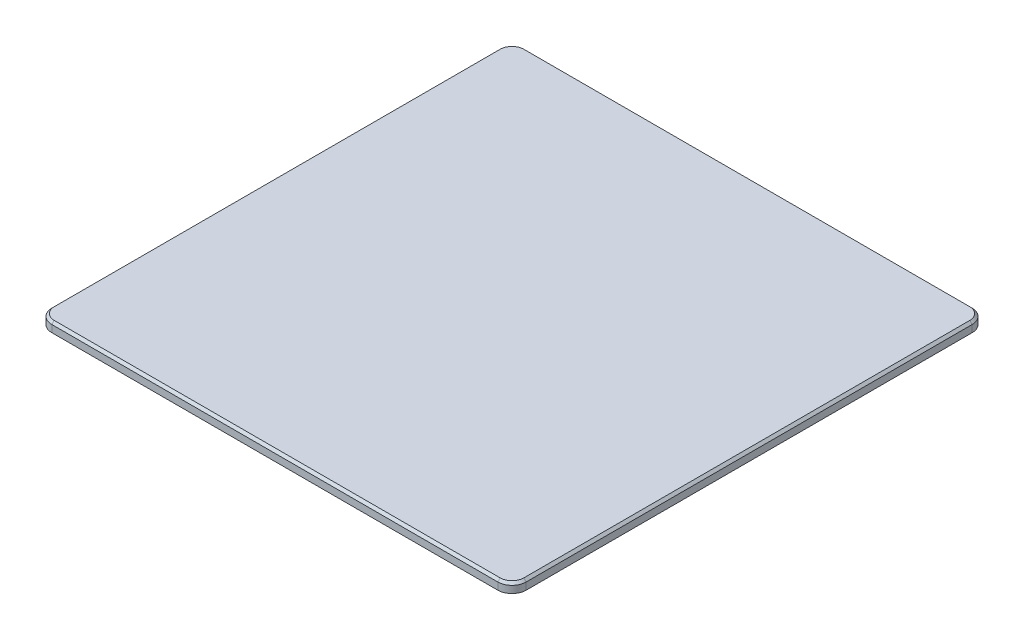
ISO-10303-21;
HEADER;
FILE_DESCRIPTION(('STEP AP214'),'2;1');
FILE_NAME('part.step','',(''),(''),'','','');
FILE_SCHEMA(('AUTOMOTIVE_DESIGN { 1 0 10303 214 1 1 1 1 }'));
ENDSEC;
DATA;
#1=APPLICATION_CONTEXT('core data for automotive mechanical design processes');
#2=APPLICATION_PROTOCOL_DEFINITION('international standard','automotive_design',2000,#1);
#3=PRODUCT_CONTEXT('',#1,'mechanical');
#4=PRODUCT('Part','Part','',(#3));
#5=PRODUCT_RELATED_PRODUCT_CATEGORY('part','',(#4));
#6=PRODUCT_DEFINITION_FORMATION('','',#4);
#7=PRODUCT_DEFINITION_CONTEXT('part definition',#1,'design');
#8=PRODUCT_DEFINITION('design','',#6,#7);
#9=PRODUCT_DEFINITION_SHAPE('','',#8);
#10=(LENGTH_UNIT() NAMED_UNIT(*) SI_UNIT(.MILLI.,.METRE.));
#11=(NAMED_UNIT(*) PLANE_ANGLE_UNIT() SI_UNIT($,.RADIAN.));
#12=(NAMED_UNIT(*) SI_UNIT($,.STERADIAN.) SOLID_ANGLE_UNIT());
#13=UNCERTAINTY_MEASURE_WITH_UNIT(LENGTH_MEASURE(1.E-05),#10,'distance_accuracy_value','');
#14=(GEOMETRIC_REPRESENTATION_CONTEXT(3) GLOBAL_UNCERTAINTY_ASSIGNED_CONTEXT((#13)) GLOBAL_UNIT_ASSIGNED_CONTEXT((#10,
#11,#12)) REPRESENTATION_CONTEXT('',''));
#15=CARTESIAN_POINT('',(0.,0.,0.));
#16=DIRECTION('',(0.,0.,1.));
#17=DIRECTION('',(1.,0.,0.));
#18=AXIS2_PLACEMENT_3D('',#15,#16,#17);
#19=CARTESIAN_POINT('',(47.,2.,-47.));
#20=DIRECTION('',(0.,-1.,0.));
#21=DIRECTION('',(0.,0.,-1.));
#22=AXIS2_PLACEMENT_3D('',#19,#20,#21);
#23=CYLINDRICAL_SURFACE('',#22,3.);
#24=DIRECTION('',(0.,-1.,0.));
#25=VECTOR('',#24,1.);
#26=CARTESIAN_POINT('',(47.,2.,-50.));
#27=LINE('',#26,#25);
#28=CARTESIAN_POINT('',(47.,1.49999999999997,-50.));
#29=VERTEX_POINT('',#28);
#30=CARTESIAN_POINT('',(47.,0.,-50.));
#31=VERTEX_POINT('',#30);
#32=EDGE_CURVE('E124',#29,#31,#27,.T.);
#33=ORIENTED_EDGE('',*,*,#32,.F.);
#34=CARTESIAN_POINT('',(47.,1.49999999999997,-47.));
#35=DIRECTION('',(0.,-1.,0.));
#36=DIRECTION('',(0.,0.,-1.));
#37=AXIS2_PLACEMENT_3D('',#34,#35,#36);
#38=CIRCLE('',#37,3.);
#39=CARTESIAN_POINT('',(50.,1.49999999999997,-47.));
#40=VERTEX_POINT('',#39);
#41=EDGE_CURVE('E11',#29,#40,#38,.T.);
#42=ORIENTED_EDGE('',*,*,#41,.T.);
#43=DIRECTION('',(0.,-1.,0.));
#44=VECTOR('',#43,1.);
#45=CARTESIAN_POINT('',(50.,2.,-47.));
#46=LINE('',#45,#44);
#47=CARTESIAN_POINT('',(50.,0.,-47.));
#48=VERTEX_POINT('',#47);
#49=EDGE_CURVE('E145',#40,#48,#46,.T.);
#50=ORIENTED_EDGE('',*,*,#49,.T.);
#51=CARTESIAN_POINT('',(47.,0.,-47.));
#52=DIRECTION('',(0.,1.,0.));
#53=DIRECTION('',(0.,0.,-1.));
#54=AXIS2_PLACEMENT_3D('',#51,#52,#53);
#55=CIRCLE('',#54,3.);
#56=EDGE_CURVE('E139',#48,#31,#55,.T.);
#57=ORIENTED_EDGE('',*,*,#56,.T.);
#58=EDGE_LOOP('',(#33,#42,#50,#57));
#59=FACE_BOUND('',#58,.T.);
#60=ADVANCED_FACE('F36',(#59),#23,.T.);
#61=CARTESIAN_POINT('',(-47.,2.,-50.));
#62=DIRECTION('',(0.,0.,1.));
#63=DIRECTION('',(1.,0.,0.));
#64=AXIS2_PLACEMENT_3D('',#61,#62,#63);
#65=PLANE('',#64);
#66=DIRECTION('',(0.,-1.,0.));
#67=VECTOR('',#66,1.);
#68=CARTESIAN_POINT('',(-47.,2.,-50.));
#69=LINE('',#68,#67);
#70=CARTESIAN_POINT('',(-47.,1.49999999999997,-50.));
#71=VERTEX_POINT('',#70);
#72=CARTESIAN_POINT('',(-47.,0.,-50.));
#73=VERTEX_POINT('',#72);
#74=EDGE_CURVE('E133',#71,#73,#69,.T.);
#75=ORIENTED_EDGE('',*,*,#74,.F.);
#76=DIRECTION('',(1.,0.,0.));
#77=VECTOR('',#76,1.);
#78=CARTESIAN_POINT('',(-47.,1.49999999999997,-50.));
#79=LINE('',#78,#77);
#80=EDGE_CURVE('E45',#71,#29,#79,.T.);
#81=ORIENTED_EDGE('',*,*,#80,.T.);
#82=ORIENTED_EDGE('',*,*,#32,.T.);
#83=DIRECTION('',(-1.,0.,0.));
#84=VECTOR('',#83,1.);
#85=CARTESIAN_POINT('',(-47.,0.,-50.));
#86=LINE('',#85,#84);
#87=EDGE_CURVE('E127',#31,#73,#86,.T.);
#88=ORIENTED_EDGE('',*,*,#87,.T.);
#89=EDGE_LOOP('',(#75,#81,#82,#88));
#90=FACE_BOUND('',#89,.T.);
#91=ADVANCED_FACE('F126',(#90),#65,.F.);
#92=CARTESIAN_POINT('',(-47.,2.,-47.));
#93=DIRECTION('',(0.,-1.,0.));
#94=DIRECTION('',(0.,0.,-1.));
#95=AXIS2_PLACEMENT_3D('',#92,#93,#94);
#96=CYLINDRICAL_SURFACE('',#95,3.);
#97=DIRECTION('',(0.,-1.,0.));
#98=VECTOR('',#97,1.);
#99=CARTESIAN_POINT('',(-50.,2.,-47.));
#100=LINE('',#99,#98);
#101=CARTESIAN_POINT('',(-50.,1.49999999999997,-47.));
#102=VERTEX_POINT('',#101);
#103=CARTESIAN_POINT('',(-50.,0.,-47.));
#104=VERTEX_POINT('',#103);
#105=EDGE_CURVE('E175',#102,#104,#100,.T.);
#106=ORIENTED_EDGE('',*,*,#105,.F.);
#107=CARTESIAN_POINT('',(-47.,1.49999999999997,-47.));
#108=DIRECTION('',(0.,-1.,0.));
#109=DIRECTION('',(0.,0.,-1.));
#110=AXIS2_PLACEMENT_3D('',#107,#108,#109);
#111=CIRCLE('',#110,3.);
#112=EDGE_CURVE('E60',#102,#71,#111,.T.);
#113=ORIENTED_EDGE('',*,*,#112,.T.);
#114=ORIENTED_EDGE('',*,*,#74,.T.);
#115=CARTESIAN_POINT('',(-47.,0.,-47.));
#116=DIRECTION('',(0.,1.,0.));
#117=DIRECTION('',(0.,0.,1.));
#118=AXIS2_PLACEMENT_3D('',#115,#116,#117);
#119=CIRCLE('',#118,3.);
#120=EDGE_CURVE('E142',#73,#104,#119,.T.);
#121=ORIENTED_EDGE('',*,*,#120,.T.);
#122=EDGE_LOOP('',(#106,#113,#114,#121));
#123=FACE_BOUND('',#122,.T.);
#124=ADVANCED_FACE('F278',(#123),#96,.T.);
#125=CARTESIAN_POINT('',(-50.,2.,-47.));
#126=DIRECTION('',(1.,0.,0.));
#127=DIRECTION('',(0.,0.,-1.));
#128=AXIS2_PLACEMENT_3D('',#125,#126,#127);
#129=PLANE('',#128);
#130=DIRECTION('',(0.,-1.,0.));
#131=VECTOR('',#130,1.);
#132=CARTESIAN_POINT('',(-50.,2.,47.));
#133=LINE('',#132,#131);
#134=CARTESIAN_POINT('',(-50.,1.49999999999997,47.));
#135=VERTEX_POINT('',#134);
#136=CARTESIAN_POINT('',(-50.,0.,47.));
#137=VERTEX_POINT('',#136);
#138=EDGE_CURVE('E173',#135,#137,#133,.T.);
#139=ORIENTED_EDGE('',*,*,#138,.F.);
#140=DIRECTION('',(0.,0.,-1.));
#141=VECTOR('',#140,1.);
#142=CARTESIAN_POINT('',(-50.,1.49999999999997,-47.));
#143=LINE('',#142,#141);
#144=EDGE_CURVE('E203',#135,#102,#143,.T.);
#145=ORIENTED_EDGE('',*,*,#144,.T.);
#146=ORIENTED_EDGE('',*,*,#105,.T.);
#147=DIRECTION('',(0.,0.,1.));
#148=VECTOR('',#147,1.);
#149=CARTESIAN_POINT('',(-50.,0.,-47.));
#150=LINE('',#149,#148);
#151=EDGE_CURVE('E152',#104,#137,#150,.T.);
#152=ORIENTED_EDGE('',*,*,#151,.T.);
#153=EDGE_LOOP('',(#139,#145,#146,#152));
#154=FACE_BOUND('',#153,.T.);
#155=ADVANCED_FACE('F276',(#154),#129,.F.);
#156=CARTESIAN_POINT('',(-47.,2.,47.));
#157=DIRECTION('',(0.,-1.,0.));
#158=DIRECTION('',(0.,0.,-1.));
#159=AXIS2_PLACEMENT_3D('',#156,#157,#158);
#160=CYLINDRICAL_SURFACE('',#159,3.);
#161=DIRECTION('',(0.,-1.,0.));
#162=VECTOR('',#161,1.);
#163=CARTESIAN_POINT('',(-47.,2.,50.));
#164=LINE('',#163,#162);
#165=CARTESIAN_POINT('',(-47.,1.49999999999997,50.));
#166=VERTEX_POINT('',#165);
#167=CARTESIAN_POINT('',(-47.,0.,50.));
#168=VERTEX_POINT('',#167);
#169=EDGE_CURVE('E171',#166,#168,#164,.T.);
#170=ORIENTED_EDGE('',*,*,#169,.F.);
#171=CARTESIAN_POINT('',(-47.,1.49999999999997,47.));
#172=DIRECTION('',(0.,-1.,0.));
#173=DIRECTION('',(0.,0.,-1.));
#174=AXIS2_PLACEMENT_3D('',#171,#172,#173);
#175=CIRCLE('',#174,3.);
#176=EDGE_CURVE('E201',#166,#135,#175,.T.);
#177=ORIENTED_EDGE('',*,*,#176,.T.);
#178=ORIENTED_EDGE('',*,*,#138,.T.);
#179=CARTESIAN_POINT('',(-47.,0.,47.));
#180=DIRECTION('',(0.,1.,0.));
#181=DIRECTION('',(0.,0.,1.));
#182=AXIS2_PLACEMENT_3D('',#179,#180,#181);
#183=CIRCLE('',#182,3.);
#184=EDGE_CURVE('E155',#137,#168,#183,.T.);
#185=ORIENTED_EDGE('',*,*,#184,.T.);
#186=EDGE_LOOP('',(#170,#177,#178,#185));
#187=FACE_BOUND('',#186,.T.);
#188=ADVANCED_FACE('F274',(#187),#160,.T.);
#189=CARTESIAN_POINT('',(-47.,2.,50.));
#190=DIRECTION('',(0.,0.,-1.));
#191=DIRECTION('',(-1.,0.,0.));
#192=AXIS2_PLACEMENT_3D('',#189,#190,#191);
#193=PLANE('',#192);
#194=DIRECTION('',(0.,-1.,0.));
#195=VECTOR('',#194,1.);
#196=CARTESIAN_POINT('',(47.,2.,50.));
#197=LINE('',#196,#195);
#198=CARTESIAN_POINT('',(47.,1.49999999999997,50.));
#199=VERTEX_POINT('',#198);
#200=CARTESIAN_POINT('',(47.,0.,50.));
#201=VERTEX_POINT('',#200);
#202=EDGE_CURVE('E169',#199,#201,#197,.T.);
#203=ORIENTED_EDGE('',*,*,#202,.F.);
#204=DIRECTION('',(-1.,0.,0.));
#205=VECTOR('',#204,1.);
#206=CARTESIAN_POINT('',(-47.,1.49999999999997,50.));
#207=LINE('',#206,#205);
#208=EDGE_CURVE('E199',#199,#166,#207,.T.);
#209=ORIENTED_EDGE('',*,*,#208,.T.);
#210=ORIENTED_EDGE('',*,*,#169,.T.);
#211=DIRECTION('',(1.,0.,0.));
#212=VECTOR('',#211,1.);
#213=CARTESIAN_POINT('',(-47.,0.,50.));
#214=LINE('',#213,#212);
#215=EDGE_CURVE('E158',#168,#201,#214,.T.);
#216=ORIENTED_EDGE('',*,*,#215,.T.);
#217=EDGE_LOOP('',(#203,#209,#210,#216));
#218=FACE_BOUND('',#217,.T.);
#219=ADVANCED_FACE('F262',(#218),#193,.F.);
#220=CARTESIAN_POINT('',(47.,2.,47.));
#221=DIRECTION('',(0.,-1.,0.));
#222=DIRECTION('',(0.,0.,-1.));
#223=AXIS2_PLACEMENT_3D('',#220,#221,#222);
#224=CYLINDRICAL_SURFACE('',#223,3.);
#225=DIRECTION('',(0.,-1.,0.));
#226=VECTOR('',#225,1.);
#227=CARTESIAN_POINT('',(50.,2.,47.));
#228=LINE('',#227,#226);
#229=CARTESIAN_POINT('',(50.,1.49999999999997,47.));
#230=VERTEX_POINT('',#229);
#231=CARTESIAN_POINT('',(50.,0.,47.));
#232=VERTEX_POINT('',#231);
#233=EDGE_CURVE('E167',#230,#232,#228,.T.);
#234=ORIENTED_EDGE('',*,*,#233,.F.);
#235=CARTESIAN_POINT('',(47.,1.49999999999997,47.));
#236=DIRECTION('',(0.,-1.,0.));
#237=DIRECTION('',(0.,0.,-1.));
#238=AXIS2_PLACEMENT_3D('',#235,#236,#237);
#239=CIRCLE('',#238,3.);
#240=EDGE_CURVE('E197',#230,#199,#239,.T.);
#241=ORIENTED_EDGE('',*,*,#240,.T.);
#242=ORIENTED_EDGE('',*,*,#202,.T.);
#243=CARTESIAN_POINT('',(47.,0.,47.));
#244=DIRECTION('',(0.,1.,0.));
#245=DIRECTION('',(0.,0.,1.));
#246=AXIS2_PLACEMENT_3D('',#243,#244,#245);
#247=CIRCLE('',#246,3.);
#248=EDGE_CURVE('E161',#201,#232,#247,.T.);
#249=ORIENTED_EDGE('',*,*,#248,.T.);
#250=EDGE_LOOP('',(#234,#241,#242,#249));
#251=FACE_BOUND('',#250,.T.);
#252=ADVANCED_FACE('F259',(#251),#224,.T.);
#253=CARTESIAN_POINT('',(50.,2.,-47.));
#254=DIRECTION('',(-1.,0.,0.));
#255=DIRECTION('',(0.,0.,1.));
#256=AXIS2_PLACEMENT_3D('',#253,#254,#255);
#257=PLANE('',#256);
#258=ORIENTED_EDGE('',*,*,#49,.F.);
#259=DIRECTION('',(0.,0.,1.));
#260=VECTOR('',#259,1.);
#261=CARTESIAN_POINT('',(50.,1.49999999999997,-47.));
#262=LINE('',#261,#260);
#263=EDGE_CURVE('E194',#40,#230,#262,.T.);
#264=ORIENTED_EDGE('',*,*,#263,.T.);
#265=ORIENTED_EDGE('',*,*,#233,.T.);
#266=DIRECTION('',(0.,0.,-1.));
#267=VECTOR('',#266,1.);
#268=CARTESIAN_POINT('',(50.,0.,-47.));
#269=LINE('',#268,#267);
#270=EDGE_CURVE('E164',#232,#48,#269,.T.);
#271=ORIENTED_EDGE('',*,*,#270,.T.);
#272=EDGE_LOOP('',(#258,#264,#265,#271));
#273=FACE_BOUND('',#272,.T.);
#274=ADVANCED_FACE('F246',(#273),#257,.F.);
#275=CARTESIAN_POINT('',(47.,2.,-47.));
#276=DIRECTION('',(0.,-1.,0.));
#277=DIRECTION('',(0.,0.,-1.));
#278=AXIS2_PLACEMENT_3D('',#275,#276,#277);
#279=PLANE('',#278);
#280=CARTESIAN_POINT('',(47.,2.,47.));
#281=DIRECTION('',(0.,-1.,0.));
#282=DIRECTION('',(0.,0.,-1.));
#283=AXIS2_PLACEMENT_3D('',#280,#281,#282);
#284=CIRCLE('',#283,2.49999999999997);
#285=CARTESIAN_POINT('',(47.,2.,49.5));
#286=VERTEX_POINT('',#285);
#287=CARTESIAN_POINT('',(49.5,2.,47.));
#288=VERTEX_POINT('',#287);
#289=EDGE_CURVE('E189',#286,#288,#284,.F.);
#290=ORIENTED_EDGE('',*,*,#289,.T.);
#291=DIRECTION('',(0.,0.,-1.));
#292=VECTOR('',#291,1.);
#293=CARTESIAN_POINT('',(49.5,2.,-47.));
#294=LINE('',#293,#292);
#295=CARTESIAN_POINT('',(49.5,2.,-47.));
#296=VERTEX_POINT('',#295);
#297=EDGE_CURVE('E191',#288,#296,#294,.T.);
#298=ORIENTED_EDGE('',*,*,#297,.T.);
#299=CARTESIAN_POINT('',(47.,2.,-47.));
#300=DIRECTION('',(0.,-1.,0.));
#301=DIRECTION('',(0.,0.,-1.));
#302=AXIS2_PLACEMENT_3D('',#299,#300,#301);
#303=CIRCLE('',#302,2.49999999999997);
#304=CARTESIAN_POINT('',(47.,2.,-49.5));
#305=VERTEX_POINT('',#304);
#306=EDGE_CURVE('E132',#296,#305,#303,.F.);
#307=ORIENTED_EDGE('',*,*,#306,.T.);
#308=DIRECTION('',(-1.,0.,0.));
#309=VECTOR('',#308,1.);
#310=CARTESIAN_POINT('',(47.,2.,-49.5));
#311=LINE('',#310,#309);
#312=CARTESIAN_POINT('',(-47.,2.,-49.5));
#313=VERTEX_POINT('',#312);
#314=EDGE_CURVE('E179',#305,#313,#311,.T.);
#315=ORIENTED_EDGE('',*,*,#314,.T.);
#316=CARTESIAN_POINT('',(-47.,2.,-47.));
#317=DIRECTION('',(0.,-1.,0.));
#318=DIRECTION('',(0.,0.,-1.));
#319=AXIS2_PLACEMENT_3D('',#316,#317,#318);
#320=CIRCLE('',#319,2.49999999999997);
#321=CARTESIAN_POINT('',(-49.5,2.,-47.));
#322=VERTEX_POINT('',#321);
#323=EDGE_CURVE('E181',#313,#322,#320,.F.);
#324=ORIENTED_EDGE('',*,*,#323,.T.);
#325=DIRECTION('',(0.,0.,1.));
#326=VECTOR('',#325,1.);
#327=CARTESIAN_POINT('',(-49.5,2.,-47.));
#328=LINE('',#327,#326);
#329=CARTESIAN_POINT('',(-49.5,2.,47.));
#330=VERTEX_POINT('',#329);
#331=EDGE_CURVE('E183',#322,#330,#328,.T.);
#332=ORIENTED_EDGE('',*,*,#331,.T.);
#333=CARTESIAN_POINT('',(-47.,2.,47.));
#334=DIRECTION('',(0.,-1.,0.));
#335=DIRECTION('',(0.,0.,-1.));
#336=AXIS2_PLACEMENT_3D('',#333,#334,#335);
#337=CIRCLE('',#336,2.49999999999997);
#338=CARTESIAN_POINT('',(-47.,2.,49.5));
#339=VERTEX_POINT('',#338);
#340=EDGE_CURVE('E185',#330,#339,#337,.F.);
#341=ORIENTED_EDGE('',*,*,#340,.T.);
#342=DIRECTION('',(1.,0.,0.));
#343=VECTOR('',#342,1.);
#344=CARTESIAN_POINT('',(47.,2.,49.5));
#345=LINE('',#344,#343);
#346=EDGE_CURVE('E187',#339,#286,#345,.T.);
#347=ORIENTED_EDGE('',*,*,#346,.T.);
#348=EDGE_LOOP('',(#290,#298,#307,#315,#324,#332,#341,#347));
#349=FACE_BOUND('',#348,.T.);
#350=ADVANCED_FACE('F234',(#349),#279,.F.);
#351=CARTESIAN_POINT('',(47.,0.,-47.));
#352=DIRECTION('',(0.,-1.,0.));
#353=DIRECTION('',(0.,0.,-1.));
#354=AXIS2_PLACEMENT_3D('',#351,#352,#353);
#355=PLANE('',#354);
#356=ORIENTED_EDGE('',*,*,#56,.F.);
#357=ORIENTED_EDGE('',*,*,#270,.F.);
#358=ORIENTED_EDGE('',*,*,#248,.F.);
#359=ORIENTED_EDGE('',*,*,#215,.F.);
#360=ORIENTED_EDGE('',*,*,#184,.F.);
#361=ORIENTED_EDGE('',*,*,#151,.F.);
#362=ORIENTED_EDGE('',*,*,#120,.F.);
#363=ORIENTED_EDGE('',*,*,#87,.F.);
#364=EDGE_LOOP('',(#356,#357,#358,#359,#360,#361,#362,#363));
#365=FACE_BOUND('',#364,.T.);
#366=ADVANCED_FACE('F137',(#365),#355,.T.);
#367=CARTESIAN_POINT('',(-49.5,2.,-47.));
#368=DIRECTION('',(0.70710678118654,-0.707106781186554,0.));
#369=DIRECTION('',(0.,0.,1.));
#370=AXIS2_PLACEMENT_3D('',#367,#368,#369);
#371=PLANE('',#370);
#372=DIRECTION('',(0.707106781186554,0.70710678118654,0.));
#373=VECTOR('',#372,1.);
#374=CARTESIAN_POINT('',(-50.,1.49999999999997,-47.));
#375=LINE('',#374,#373);
#376=EDGE_CURVE('E149',#102,#322,#375,.T.);
#377=ORIENTED_EDGE('',*,*,#376,.F.);
#378=ORIENTED_EDGE('',*,*,#144,.F.);
#379=DIRECTION('',(-0.707106781186554,-0.70710678118654,0.));
#380=VECTOR('',#379,1.);
#381=CARTESIAN_POINT('',(-49.5,2.,47.));
#382=LINE('',#381,#380);
#383=EDGE_CURVE('E40',#330,#135,#382,.T.);
#384=ORIENTED_EDGE('',*,*,#383,.F.);
#385=ORIENTED_EDGE('',*,*,#331,.F.);
#386=EDGE_LOOP('',(#377,#378,#384,#385));
#387=FACE_BOUND('',#386,.T.);
#388=ADVANCED_FACE('F38',(#387),#371,.F.);
#389=CARTESIAN_POINT('',(-47.,2.,47.));
#390=DIRECTION('',(0.,-1.,0.));
#391=DIRECTION('',(0.,0.,-1.));
#392=AXIS2_PLACEMENT_3D('',#389,#390,#391);
#393=CONICAL_SURFACE('',#392,2.49999999999997,0.785398163397448);
#394=ORIENTED_EDGE('',*,*,#383,.T.);
#395=ORIENTED_EDGE('',*,*,#176,.F.);
#396=DIRECTION('',(0.,-0.707106781186545,0.70710678118655));
#397=VECTOR('',#396,1.);
#398=CARTESIAN_POINT('',(-47.,2.,49.5));
#399=LINE('',#398,#397);
#400=EDGE_CURVE('E220',#339,#166,#399,.T.);
#401=ORIENTED_EDGE('',*,*,#400,.F.);
#402=ORIENTED_EDGE('',*,*,#340,.F.);
#403=EDGE_LOOP('',(#394,#395,#401,#402));
#404=FACE_BOUND('',#403,.T.);
#405=ADVANCED_FACE('F271',(#404),#393,.T.);
#406=CARTESIAN_POINT('',(-47.,2.,-47.));
#407=DIRECTION('',(0.,-1.,0.));
#408=DIRECTION('',(0.,0.,-1.));
#409=AXIS2_PLACEMENT_3D('',#406,#407,#408);
#410=CONICAL_SURFACE('',#409,2.49999999999997,0.785398163397451);
#411=ORIENTED_EDGE('',*,*,#376,.T.);
#412=ORIENTED_EDGE('',*,*,#323,.F.);
#413=DIRECTION('',(0.,0.707106781186545,0.70710678118655));
#414=VECTOR('',#413,1.);
#415=CARTESIAN_POINT('',(-47.,1.49999999999997,-50.));
#416=LINE('',#415,#414);
#417=EDGE_CURVE('E217',#71,#313,#416,.T.);
#418=ORIENTED_EDGE('',*,*,#417,.F.);
#419=ORIENTED_EDGE('',*,*,#112,.F.);
#420=EDGE_LOOP('',(#411,#412,#418,#419));
#421=FACE_BOUND('',#420,.T.);
#422=ADVANCED_FACE('F226',(#421),#410,.T.);
#423=CARTESIAN_POINT('',(47.,2.,49.5));
#424=DIRECTION('',(0.,-0.70710678118655,-0.707106781186545));
#425=DIRECTION('',(1.,0.,0.));
#426=AXIS2_PLACEMENT_3D('',#423,#424,#425);
#427=PLANE('',#426);
#428=ORIENTED_EDGE('',*,*,#400,.T.);
#429=ORIENTED_EDGE('',*,*,#208,.F.);
#430=DIRECTION('',(0.,-0.707106781186545,0.70710678118655));
#431=VECTOR('',#430,1.);
#432=CARTESIAN_POINT('',(47.,2.,49.5));
#433=LINE('',#432,#431);
#434=EDGE_CURVE('E214',#286,#199,#433,.T.);
#435=ORIENTED_EDGE('',*,*,#434,.F.);
#436=ORIENTED_EDGE('',*,*,#346,.F.);
#437=EDGE_LOOP('',(#428,#429,#435,#436));
#438=FACE_BOUND('',#437,.T.);
#439=ADVANCED_FACE('F267',(#438),#427,.F.);
#440=CARTESIAN_POINT('',(47.,2.,-49.5));
#441=DIRECTION('',(0.,-0.70710678118655,0.707106781186545));
#442=DIRECTION('',(-1.,0.,0.));
#443=AXIS2_PLACEMENT_3D('',#440,#441,#442);
#444=PLANE('',#443);
#445=ORIENTED_EDGE('',*,*,#417,.T.);
#446=ORIENTED_EDGE('',*,*,#314,.F.);
#447=DIRECTION('',(0.,0.707106781186545,0.70710678118655));
#448=VECTOR('',#447,1.);
#449=CARTESIAN_POINT('',(47.,1.49999999999997,-50.));
#450=LINE('',#449,#448);
#451=EDGE_CURVE('E211',#29,#305,#450,.T.);
#452=ORIENTED_EDGE('',*,*,#451,.F.);
#453=ORIENTED_EDGE('',*,*,#80,.F.);
#454=EDGE_LOOP('',(#445,#446,#452,#453));
#455=FACE_BOUND('',#454,.T.);
#456=ADVANCED_FACE('F239',(#455),#444,.F.);
#457=CARTESIAN_POINT('',(47.,2.,47.));
#458=DIRECTION('',(0.,-1.,0.));
#459=DIRECTION('',(0.,0.,-1.));
#460=AXIS2_PLACEMENT_3D('',#457,#458,#459);
#461=CONICAL_SURFACE('',#460,2.49999999999997,0.785398163397451);
#462=ORIENTED_EDGE('',*,*,#434,.T.);
#463=ORIENTED_EDGE('',*,*,#240,.F.);
#464=DIRECTION('',(0.70710678118655,-0.707106781186545,0.));
#465=VECTOR('',#464,1.);
#466=CARTESIAN_POINT('',(49.5,2.,47.));
#467=LINE('',#466,#465);
#468=EDGE_CURVE('E209',#288,#230,#467,.T.);
#469=ORIENTED_EDGE('',*,*,#468,.F.);
#470=ORIENTED_EDGE('',*,*,#289,.F.);
#471=EDGE_LOOP('',(#462,#463,#469,#470));
#472=FACE_BOUND('',#471,.T.);
#473=ADVANCED_FACE('F255',(#472),#461,.T.);
#474=CARTESIAN_POINT('',(47.,2.,-47.));
#475=DIRECTION('',(0.,-1.,0.));
#476=DIRECTION('',(0.,0.,-1.));
#477=AXIS2_PLACEMENT_3D('',#474,#475,#476);
#478=CONICAL_SURFACE('',#477,2.49999999999997,0.785398163397451);
#479=ORIENTED_EDGE('',*,*,#451,.T.);
#480=ORIENTED_EDGE('',*,*,#306,.F.);
#481=DIRECTION('',(-0.70710678118655,0.707106781186545,0.));
#482=VECTOR('',#481,1.);
#483=CARTESIAN_POINT('',(50.,1.49999999999997,-47.));
#484=LINE('',#483,#482);
#485=EDGE_CURVE('E207',#40,#296,#484,.T.);
#486=ORIENTED_EDGE('',*,*,#485,.F.);
#487=ORIENTED_EDGE('',*,*,#41,.F.);
#488=EDGE_LOOP('',(#479,#480,#486,#487));
#489=FACE_BOUND('',#488,.T.);
#490=ADVANCED_FACE('F242',(#489),#478,.T.);
#491=CARTESIAN_POINT('',(49.5,2.,-47.));
#492=DIRECTION('',(-0.707106781186545,-0.70710678118655,0.));
#493=DIRECTION('',(0.,0.,-1.));
#494=AXIS2_PLACEMENT_3D('',#491,#492,#493);
#495=PLANE('',#494);
#496=ORIENTED_EDGE('',*,*,#468,.T.);
#497=ORIENTED_EDGE('',*,*,#263,.F.);
#498=ORIENTED_EDGE('',*,*,#485,.T.);
#499=ORIENTED_EDGE('',*,*,#297,.F.);
#500=EDGE_LOOP('',(#496,#497,#498,#499));
#501=FACE_BOUND('',#500,.T.);
#502=ADVANCED_FACE('F249',(#501),#495,.F.);
#503=CLOSED_SHELL('',(#60,#91,#124,#155,#188,#219,#252,#274,#350,#366,#388,#405,#422,#439,#456,
#473,#490,#502));
#504=MANIFOLD_SOLID_BREP('B2',#503);
#505=ADVANCED_BREP_SHAPE_REPRESENTATION('',(#18,#504),#14);
#506=SHAPE_DEFINITION_REPRESENTATION(#9,#505);
ENDSEC;
END-ISO-10303-21;
